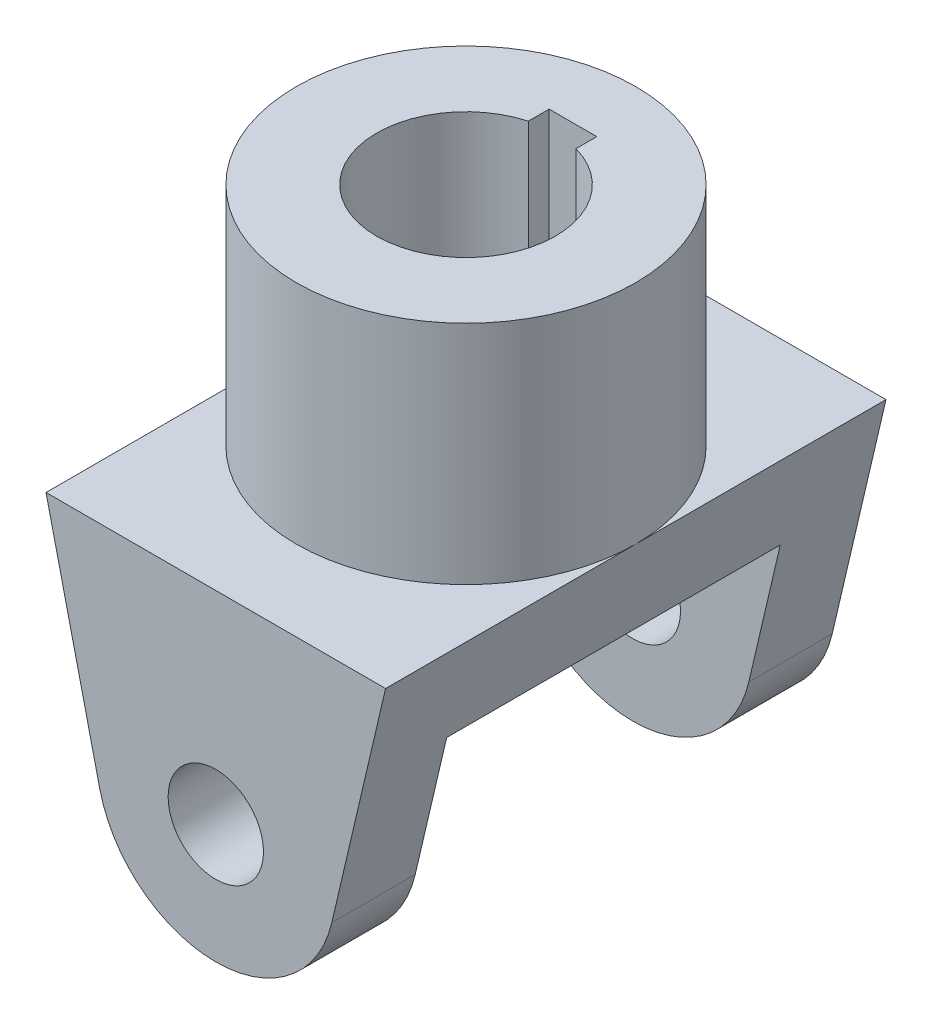
ISO-10303-21;
HEADER;
FILE_DESCRIPTION(('STEP AP214'),'2;1');
FILE_NAME('part.step','',(''),(''),'','','');
FILE_SCHEMA(('AUTOMOTIVE_DESIGN { 1 0 10303 214 1 1 1 1 }'));
ENDSEC;
DATA;
#1=APPLICATION_CONTEXT('core data for automotive mechanical design processes');
#2=APPLICATION_PROTOCOL_DEFINITION('international standard','automotive_design',2000,#1);
#3=PRODUCT_CONTEXT('',#1,'mechanical');
#4=PRODUCT('Part','Part','',(#3));
#5=PRODUCT_RELATED_PRODUCT_CATEGORY('part','',(#4));
#6=PRODUCT_DEFINITION_FORMATION('','',#4);
#7=PRODUCT_DEFINITION_CONTEXT('part definition',#1,'design');
#8=PRODUCT_DEFINITION('design','',#6,#7);
#9=PRODUCT_DEFINITION_SHAPE('','',#8);
#10=(LENGTH_UNIT() NAMED_UNIT(*) SI_UNIT(.MILLI.,.METRE.));
#11=(NAMED_UNIT(*) PLANE_ANGLE_UNIT() SI_UNIT($,.RADIAN.));
#12=(NAMED_UNIT(*) SI_UNIT($,.STERADIAN.) SOLID_ANGLE_UNIT());
#13=UNCERTAINTY_MEASURE_WITH_UNIT(LENGTH_MEASURE(1.E-05),#10,'distance_accuracy_value','');
#14=(GEOMETRIC_REPRESENTATION_CONTEXT(3) GLOBAL_UNCERTAINTY_ASSIGNED_CONTEXT((#13)) GLOBAL_UNIT_ASSIGNED_CONTEXT((#10,
#11,#12)) REPRESENTATION_CONTEXT('',''));
#15=CARTESIAN_POINT('',(0.,0.,0.));
#16=DIRECTION('',(0.,0.,1.));
#17=DIRECTION('',(1.,0.,0.));
#18=AXIS2_PLACEMENT_3D('',#15,#16,#17);
#19=CARTESIAN_POINT('',(28.5,-16.,-42.));
#20=DIRECTION('',(0.,0.,1.));
#21=DIRECTION('',(1.,0.,0.));
#22=AXIS2_PLACEMENT_3D('',#19,#20,#21);
#23=PLANE('',#22);
#24=CARTESIAN_POINT('',(0.,-34.,-42.));
#25=DIRECTION('',(0.,0.,-1.));
#26=DIRECTION('',(-1.,0.,0.));
#27=AXIS2_PLACEMENT_3D('',#24,#25,#26);
#28=CIRCLE('',#27,8.);
#29=CARTESIAN_POINT('',(-8.,-34.,-42.));
#30=VERTEX_POINT('',#29);
#31=EDGE_CURVE('E273',#30,#30,#28,.T.);
#32=ORIENTED_EDGE('',*,*,#31,.F.);
#33=EDGE_LOOP('',(#32));
#34=FACE_BOUND('',#33,.T.);
#35=DIRECTION('',(-0.227934655607735,-0.973676431250641,0.));
#36=VECTOR('',#35,1.);
#37=CARTESIAN_POINT('',(27.01930509403,-6.32513615786876,-42.));
#38=LINE('',#37,#36);
#39=CARTESIAN_POINT('',(28.5,0.,-42.));
#40=VERTEX_POINT('',#39);
#41=CARTESIAN_POINT('',(19.4735222245543,-38.5587204531304,-42.));
#42=VERTEX_POINT('',#41);
#43=EDGE_CURVE('E286',#40,#42,#38,.T.);
#44=ORIENTED_EDGE('',*,*,#43,.T.);
#45=CARTESIAN_POINT('',(0.,-34.,-42.));
#46=DIRECTION('',(0.,0.,1.));
#47=DIRECTION('',(1.,0.,0.));
#48=AXIS2_PLACEMENT_3D('',#45,#46,#47);
#49=CIRCLE('',#48,20.);
#50=CARTESIAN_POINT('',(-19.4735286250151,-38.558693112145,-42.));
#51=VERTEX_POINT('',#50);
#52=EDGE_CURVE('E261',#51,#42,#49,.T.);
#53=ORIENTED_EDGE('',*,*,#52,.F.);
#54=DIRECTION('',(0.22793465560725,-0.973676431250754,0.));
#55=VECTOR('',#54,1.);
#56=CARTESIAN_POINT('',(-27.0193050940363,-6.32513615785605,-42.));
#57=LINE('',#56,#55);
#58=CARTESIAN_POINT('',(-28.5,0.,-42.));
#59=VERTEX_POINT('',#58);
#60=EDGE_CURVE('E263',#59,#51,#57,.T.);
#61=ORIENTED_EDGE('',*,*,#60,.F.);
#62=DIRECTION('',(1.,0.,0.));
#63=VECTOR('',#62,1.);
#64=CARTESIAN_POINT('',(28.5,0.,-42.));
#65=LINE('',#64,#63);
#66=EDGE_CURVE('E229',#59,#40,#65,.T.);
#67=ORIENTED_EDGE('',*,*,#66,.T.);
#68=EDGE_LOOP('',(#44,#53,#61,#67));
#69=FACE_BOUND('',#68,.T.);
#70=ADVANCED_FACE('F63',(#34,#69),#23,.F.);
#71=CARTESIAN_POINT('',(28.5,-16.,42.));
#72=DIRECTION('',(0.,0.,-1.));
#73=DIRECTION('',(-1.,0.,0.));
#74=AXIS2_PLACEMENT_3D('',#71,#72,#73);
#75=PLANE('',#74);
#76=CARTESIAN_POINT('',(0.,-34.,42.));
#77=DIRECTION('',(0.,0.,-1.));
#78=DIRECTION('',(-1.,0.,0.));
#79=AXIS2_PLACEMENT_3D('',#76,#77,#78);
#80=CIRCLE('',#79,8.);
#81=CARTESIAN_POINT('',(-8.00000000000001,-34.,42.));
#82=VERTEX_POINT('',#81);
#83=EDGE_CURVE('E199',#82,#82,#80,.T.);
#84=ORIENTED_EDGE('',*,*,#83,.T.);
#85=EDGE_LOOP('',(#84));
#86=FACE_BOUND('',#85,.T.);
#87=CARTESIAN_POINT('',(0.,-34.,42.));
#88=DIRECTION('',(0.,0.,1.));
#89=DIRECTION('',(1.,0.,0.));
#90=AXIS2_PLACEMENT_3D('',#87,#88,#89);
#91=CIRCLE('',#90,20.);
#92=CARTESIAN_POINT('',(-19.4735286250151,-38.558693112145,42.));
#93=VERTEX_POINT('',#92);
#94=CARTESIAN_POINT('',(19.4735222245543,-38.5587204531304,42.));
#95=VERTEX_POINT('',#94);
#96=EDGE_CURVE('E250',#93,#95,#91,.T.);
#97=ORIENTED_EDGE('',*,*,#96,.T.);
#98=DIRECTION('',(-0.227934655607735,-0.973676431250641,0.));
#99=VECTOR('',#98,1.);
#100=CARTESIAN_POINT('',(27.01930509403,-6.32513615786876,42.));
#101=LINE('',#100,#99);
#102=CARTESIAN_POINT('',(28.5,0.,42.));
#103=VERTEX_POINT('',#102);
#104=EDGE_CURVE('E240',#103,#95,#101,.T.);
#105=ORIENTED_EDGE('',*,*,#104,.F.);
#106=DIRECTION('',(-1.,0.,0.));
#107=VECTOR('',#106,1.);
#108=CARTESIAN_POINT('',(28.5,0.,42.));
#109=LINE('',#108,#107);
#110=CARTESIAN_POINT('',(-28.5,0.,42.));
#111=VERTEX_POINT('',#110);
#112=EDGE_CURVE('E181',#103,#111,#109,.T.);
#113=ORIENTED_EDGE('',*,*,#112,.T.);
#114=DIRECTION('',(0.22793465560725,-0.973676431250754,0.));
#115=VECTOR('',#114,1.);
#116=CARTESIAN_POINT('',(-27.0193050940363,-6.32513615785605,42.));
#117=LINE('',#116,#115);
#118=EDGE_CURVE('E258',#111,#93,#117,.T.);
#119=ORIENTED_EDGE('',*,*,#118,.T.);
#120=EDGE_LOOP('',(#97,#105,#113,#119));
#121=FACE_BOUND('',#120,.T.);
#122=ADVANCED_FACE('F246',(#86,#121),#75,.F.);
#123=CARTESIAN_POINT('',(0.,0.,28.));
#124=DIRECTION('',(0.,0.,1.));
#125=DIRECTION('',(1.,0.,0.));
#126=AXIS2_PLACEMENT_3D('',#123,#124,#125);
#127=PLANE('',#126);
#128=CARTESIAN_POINT('',(0.,-34.,28.));
#129=DIRECTION('',(0.,0.,1.));
#130=DIRECTION('',(1.,0.,0.));
#131=AXIS2_PLACEMENT_3D('',#128,#129,#130);
#132=CIRCLE('',#131,8.);
#133=CARTESIAN_POINT('',(-8.00000000000001,-34.,28.));
#134=VERTEX_POINT('',#133);
#135=EDGE_CURVE('E198',#134,#134,#132,.T.);
#136=ORIENTED_EDGE('',*,*,#135,.T.);
#137=EDGE_LOOP('',(#136));
#138=FACE_BOUND('',#137,.T.);
#139=DIRECTION('',(-0.227934655607735,-0.973676431250641,0.));
#140=VECTOR('',#139,1.);
#141=CARTESIAN_POINT('',(27.01930509403,-6.32513615786876,28.));
#142=LINE('',#141,#140);
#143=CARTESIAN_POINT('',(24.7544492475396,-16.,28.));
#144=VERTEX_POINT('',#143);
#145=CARTESIAN_POINT('',(19.4735222245543,-38.5587204531304,28.));
#146=VERTEX_POINT('',#145);
#147=EDGE_CURVE('E265',#144,#146,#142,.T.);
#148=ORIENTED_EDGE('',*,*,#147,.T.);
#149=CARTESIAN_POINT('',(0.,-34.,28.));
#150=DIRECTION('',(0.,0.,1.));
#151=DIRECTION('',(1.,0.,0.));
#152=AXIS2_PLACEMENT_3D('',#149,#150,#151);
#153=CIRCLE('',#152,20.);
#154=CARTESIAN_POINT('',(-19.4735286250151,-38.558693112145,28.));
#155=VERTEX_POINT('',#154);
#156=EDGE_CURVE('E271',#155,#146,#153,.T.);
#157=ORIENTED_EDGE('',*,*,#156,.F.);
#158=DIRECTION('',(0.22793465560725,-0.973676431250754,0.));
#159=VECTOR('',#158,1.);
#160=CARTESIAN_POINT('',(-27.0193050940363,-6.32513615785605,28.));
#161=LINE('',#160,#159);
#162=CARTESIAN_POINT('',(-24.7544492475481,-16.,28.));
#163=VERTEX_POINT('',#162);
#164=EDGE_CURVE('E214',#163,#155,#161,.T.);
#165=ORIENTED_EDGE('',*,*,#164,.F.);
#166=DIRECTION('',(-1.,0.,0.));
#167=VECTOR('',#166,1.);
#168=CARTESIAN_POINT('',(-28.5,-16.,28.));
#169=LINE('',#168,#167);
#170=EDGE_CURVE('E67',#144,#163,#169,.T.);
#171=ORIENTED_EDGE('',*,*,#170,.F.);
#172=EDGE_LOOP('',(#148,#157,#165,#171));
#173=FACE_BOUND('',#172,.T.);
#174=ADVANCED_FACE('F303',(#138,#173),#127,.F.);
#175=CARTESIAN_POINT('',(0.,0.,-28.));
#176=DIRECTION('',(0.,0.,-1.));
#177=DIRECTION('',(-1.,0.,0.));
#178=AXIS2_PLACEMENT_3D('',#175,#176,#177);
#179=PLANE('',#178);
#180=CARTESIAN_POINT('',(0.,-34.,-28.));
#181=DIRECTION('',(0.,0.,-1.));
#182=DIRECTION('',(-1.,0.,0.));
#183=AXIS2_PLACEMENT_3D('',#180,#181,#182);
#184=CIRCLE('',#183,8.);
#185=CARTESIAN_POINT('',(-8.00000000000001,-34.,-28.));
#186=VERTEX_POINT('',#185);
#187=EDGE_CURVE('E195',#186,#186,#184,.T.);
#188=ORIENTED_EDGE('',*,*,#187,.T.);
#189=EDGE_LOOP('',(#188));
#190=FACE_BOUND('',#189,.T.);
#191=CARTESIAN_POINT('',(0.,-34.,-28.));
#192=DIRECTION('',(0.,0.,-1.));
#193=DIRECTION('',(-1.,0.,0.));
#194=AXIS2_PLACEMENT_3D('',#191,#192,#193);
#195=CIRCLE('',#194,20.);
#196=CARTESIAN_POINT('',(19.4735222245543,-38.5587204531304,-28.));
#197=VERTEX_POINT('',#196);
#198=CARTESIAN_POINT('',(-19.4735286250151,-38.558693112145,-28.));
#199=VERTEX_POINT('',#198);
#200=EDGE_CURVE('E12',#197,#199,#195,.T.);
#201=ORIENTED_EDGE('',*,*,#200,.F.);
#202=DIRECTION('',(0.227934655607735,0.973676431250641,0.));
#203=VECTOR('',#202,1.);
#204=CARTESIAN_POINT('',(27.01930509403,-6.32513615786876,-28.));
#205=LINE('',#204,#203);
#206=CARTESIAN_POINT('',(24.7544492475396,-16.,-28.));
#207=VERTEX_POINT('',#206);
#208=EDGE_CURVE('E219',#197,#207,#205,.T.);
#209=ORIENTED_EDGE('',*,*,#208,.T.);
#210=DIRECTION('',(1.,0.,0.));
#211=VECTOR('',#210,1.);
#212=CARTESIAN_POINT('',(28.5,-16.,-28.));
#213=LINE('',#212,#211);
#214=CARTESIAN_POINT('',(-24.7544492475481,-16.,-28.));
#215=VERTEX_POINT('',#214);
#216=EDGE_CURVE('E212',#215,#207,#213,.T.);
#217=ORIENTED_EDGE('',*,*,#216,.F.);
#218=DIRECTION('',(-0.22793465560725,0.973676431250754,0.));
#219=VECTOR('',#218,1.);
#220=CARTESIAN_POINT('',(-27.0193050940363,-6.32513615785605,-28.));
#221=LINE('',#220,#219);
#222=EDGE_CURVE('E73',#199,#215,#221,.T.);
#223=ORIENTED_EDGE('',*,*,#222,.F.);
#224=EDGE_LOOP('',(#201,#209,#217,#223));
#225=FACE_BOUND('',#224,.T.);
#226=ADVANCED_FACE('F217',(#190,#225),#179,.F.);
#227=CARTESIAN_POINT('',(0.,-16.,0.));
#228=DIRECTION('',(0.,1.,0.));
#229=DIRECTION('',(0.,0.,1.));
#230=AXIS2_PLACEMENT_3D('',#227,#228,#229);
#231=PLANE('',#230);
#232=ORIENTED_EDGE('',*,*,#216,.T.);
#233=DIRECTION('',(0.,0.,1.));
#234=VECTOR('',#233,1.);
#235=CARTESIAN_POINT('',(24.7544492475396,-16.,0.));
#236=LINE('',#235,#234);
#237=EDGE_CURVE('E296',#207,#144,#236,.T.);
#238=ORIENTED_EDGE('',*,*,#237,.T.);
#239=ORIENTED_EDGE('',*,*,#170,.T.);
#240=DIRECTION('',(0.,0.,1.));
#241=VECTOR('',#240,1.);
#242=CARTESIAN_POINT('',(-24.7544492475481,-16.,0.));
#243=LINE('',#242,#241);
#244=EDGE_CURVE('E204',#215,#163,#243,.T.);
#245=ORIENTED_EDGE('',*,*,#244,.F.);
#246=EDGE_LOOP('',(#232,#238,#239,#245));
#247=FACE_BOUND('',#246,.T.);
#248=ADVANCED_FACE('F210',(#247),#231,.F.);
#249=CARTESIAN_POINT('',(0.,38.,0.));
#250=DIRECTION('',(0.,1.,0.));
#251=DIRECTION('',(0.,0.,1.));
#252=AXIS2_PLACEMENT_3D('',#249,#250,#251);
#253=PLANE('',#252);
#254=DIRECTION('',(0.,0.,1.));
#255=VECTOR('',#254,1.);
#256=CARTESIAN_POINT('',(-4.,38.,-17.956832294801));
#257=LINE('',#256,#255);
#258=CARTESIAN_POINT('',(-4.,38.,-17.956832294801));
#259=VERTEX_POINT('',#258);
#260=CARTESIAN_POINT('',(-4.,38.,-14.456832294801));
#261=VERTEX_POINT('',#260);
#262=EDGE_CURVE('E344',#259,#261,#257,.T.);
#263=ORIENTED_EDGE('',*,*,#262,.F.);
#264=DIRECTION('',(-1.,0.,0.));
#265=VECTOR('',#264,1.);
#266=CARTESIAN_POINT('',(-4.,38.,-17.956832294801));
#267=LINE('',#266,#265);
#268=CARTESIAN_POINT('',(4.,38.,-17.956832294801));
#269=VERTEX_POINT('',#268);
#270=EDGE_CURVE('E483',#269,#259,#267,.T.);
#271=ORIENTED_EDGE('',*,*,#270,.F.);
#272=DIRECTION('',(0.,0.,-1.));
#273=VECTOR('',#272,1.);
#274=CARTESIAN_POINT('',(4.,38.,-17.956832294801));
#275=LINE('',#274,#273);
#276=CARTESIAN_POINT('',(4.,38.,-14.456832294801));
#277=VERTEX_POINT('',#276);
#278=EDGE_CURVE('E484',#277,#269,#275,.T.);
#279=ORIENTED_EDGE('',*,*,#278,.F.);
#280=CARTESIAN_POINT('',(0.,38.,0.));
#281=DIRECTION('',(0.,1.,0.));
#282=DIRECTION('',(0.,0.,1.));
#283=AXIS2_PLACEMENT_3D('',#280,#281,#282);
#284=CIRCLE('',#283,15.);
#285=EDGE_CURVE('E177',#261,#277,#284,.T.);
#286=ORIENTED_EDGE('',*,*,#285,.F.);
#287=EDGE_LOOP('',(#263,#271,#279,#286));
#288=FACE_BOUND('',#287,.T.);
#289=CARTESIAN_POINT('',(0.,38.,0.));
#290=DIRECTION('',(0.,1.,0.));
#291=DIRECTION('',(0.,0.,1.));
#292=AXIS2_PLACEMENT_3D('',#289,#290,#291);
#293=CIRCLE('',#292,28.5);
#294=CARTESIAN_POINT('',(0.,38.,28.5));
#295=VERTEX_POINT('',#294);
#296=EDGE_CURVE('E189',#295,#295,#293,.T.);
#297=ORIENTED_EDGE('',*,*,#296,.T.);
#298=EDGE_LOOP('',(#297));
#299=FACE_BOUND('',#298,.T.);
#300=ADVANCED_FACE('F327',(#288,#299),#253,.T.);
#301=CARTESIAN_POINT('',(0.,38.,0.));
#302=DIRECTION('',(0.,-1.,0.));
#303=DIRECTION('',(0.,0.,-1.));
#304=AXIS2_PLACEMENT_3D('',#301,#302,#303);
#305=CYLINDRICAL_SURFACE('',#304,28.5);
#306=ORIENTED_EDGE('',*,*,#296,.F.);
#307=EDGE_LOOP('',(#306));
#308=FACE_BOUND('',#307,.T.);
#309=CARTESIAN_POINT('',(0.,0.,0.));
#310=DIRECTION('',(0.,1.,0.));
#311=DIRECTION('',(0.,0.,1.));
#312=AXIS2_PLACEMENT_3D('',#309,#310,#311);
#313=CIRCLE('',#312,28.5);
#314=CARTESIAN_POINT('',(28.5,0.,0.));
#315=VERTEX_POINT('',#314);
#316=CARTESIAN_POINT('',(-28.5,0.,0.));
#317=VERTEX_POINT('',#316);
#318=EDGE_CURVE('E192',#315,#317,#313,.T.);
#319=ORIENTED_EDGE('',*,*,#318,.T.);
#320=EDGE_CURVE('E183',#317,#315,#313,.T.);
#321=ORIENTED_EDGE('',*,*,#320,.T.);
#322=EDGE_LOOP('',(#319,#321));
#323=FACE_BOUND('',#322,.T.);
#324=ADVANCED_FACE('F65',(#308,#323),#305,.T.);
#325=CARTESIAN_POINT('',(0.,38.,0.));
#326=DIRECTION('',(0.,-1.,0.));
#327=DIRECTION('',(0.,0.,-1.));
#328=AXIS2_PLACEMENT_3D('',#325,#326,#327);
#329=CYLINDRICAL_SURFACE('',#328,15.);
#330=DIRECTION('',(0.,1.,0.));
#331=VECTOR('',#330,1.);
#332=CARTESIAN_POINT('',(-4.,0.,-14.456832294801));
#333=LINE('',#332,#331);
#334=CARTESIAN_POINT('',(-4.,0.,-14.456832294801));
#335=VERTEX_POINT('',#334);
#336=EDGE_CURVE('E178',#335,#261,#333,.T.);
#337=ORIENTED_EDGE('',*,*,#336,.T.);
#338=ORIENTED_EDGE('',*,*,#285,.T.);
#339=DIRECTION('',(0.,1.,0.));
#340=VECTOR('',#339,1.);
#341=CARTESIAN_POINT('',(4.,0.,-14.456832294801));
#342=LINE('',#341,#340);
#343=CARTESIAN_POINT('',(4.,0.,-14.456832294801));
#344=VERTEX_POINT('',#343);
#345=EDGE_CURVE('E164',#344,#277,#342,.T.);
#346=ORIENTED_EDGE('',*,*,#345,.F.);
#347=CARTESIAN_POINT('',(0.,0.,0.));
#348=DIRECTION('',(0.,1.,0.));
#349=DIRECTION('',(0.,0.,1.));
#350=AXIS2_PLACEMENT_3D('',#347,#348,#349);
#351=CIRCLE('',#350,15.);
#352=EDGE_CURVE('E175',#335,#344,#351,.T.);
#353=ORIENTED_EDGE('',*,*,#352,.F.);
#354=EDGE_LOOP('',(#337,#338,#346,#353));
#355=FACE_BOUND('',#354,.T.);
#356=ADVANCED_FACE('F174',(#355),#329,.F.);
#357=CARTESIAN_POINT('',(0.,0.,0.));
#358=DIRECTION('',(0.,1.,0.));
#359=DIRECTION('',(0.,0.,1.));
#360=AXIS2_PLACEMENT_3D('',#357,#358,#359);
#361=PLANE('',#360);
#362=ORIENTED_EDGE('',*,*,#352,.T.);
#363=DIRECTION('',(0.,0.,-1.));
#364=VECTOR('',#363,1.);
#365=CARTESIAN_POINT('',(4.,0.,-17.956832294801));
#366=LINE('',#365,#364);
#367=CARTESIAN_POINT('',(4.,0.,-17.956832294801));
#368=VERTEX_POINT('',#367);
#369=EDGE_CURVE('E160',#344,#368,#366,.T.);
#370=ORIENTED_EDGE('',*,*,#369,.T.);
#371=DIRECTION('',(-1.,0.,0.));
#372=VECTOR('',#371,1.);
#373=CARTESIAN_POINT('',(-4.,0.,-17.956832294801));
#374=LINE('',#373,#372);
#375=CARTESIAN_POINT('',(-4.,0.,-17.956832294801));
#376=VERTEX_POINT('',#375);
#377=EDGE_CURVE('E168',#368,#376,#374,.T.);
#378=ORIENTED_EDGE('',*,*,#377,.T.);
#379=DIRECTION('',(0.,0.,1.));
#380=VECTOR('',#379,1.);
#381=CARTESIAN_POINT('',(-4.,0.,-17.956832294801));
#382=LINE('',#381,#380);
#383=EDGE_CURVE('E80',#376,#335,#382,.T.);
#384=ORIENTED_EDGE('',*,*,#383,.T.);
#385=EDGE_LOOP('',(#362,#370,#378,#384));
#386=FACE_BOUND('',#385,.T.);
#387=ADVANCED_FACE('F180',(#386),#361,.T.);
#388=ORIENTED_EDGE('',*,*,#318,.F.);
#389=DIRECTION('',(0.,0.,1.));
#390=VECTOR('',#389,1.);
#391=CARTESIAN_POINT('',(28.5,0.,42.));
#392=LINE('',#391,#390);
#393=EDGE_CURVE('E186',#40,#315,#392,.T.);
#394=ORIENTED_EDGE('',*,*,#393,.F.);
#395=ORIENTED_EDGE('',*,*,#66,.F.);
#396=DIRECTION('',(0.,0.,-1.));
#397=VECTOR('',#396,1.);
#398=CARTESIAN_POINT('',(-28.5,0.,42.));
#399=LINE('',#398,#397);
#400=EDGE_CURVE('E221',#317,#59,#399,.T.);
#401=ORIENTED_EDGE('',*,*,#400,.F.);
#402=EDGE_LOOP('',(#388,#394,#395,#401));
#403=FACE_BOUND('',#402,.T.);
#404=ADVANCED_FACE('F330',(#403),#361,.T.);
#405=ORIENTED_EDGE('',*,*,#320,.F.);
#406=EDGE_CURVE('E227',#111,#317,#399,.T.);
#407=ORIENTED_EDGE('',*,*,#406,.F.);
#408=ORIENTED_EDGE('',*,*,#112,.F.);
#409=EDGE_CURVE('E232',#315,#103,#392,.T.);
#410=ORIENTED_EDGE('',*,*,#409,.F.);
#411=EDGE_LOOP('',(#405,#407,#408,#410));
#412=FACE_BOUND('',#411,.T.);
#413=ADVANCED_FACE('F254',(#412),#361,.T.);
#414=CARTESIAN_POINT('',(0.,-34.,42.));
#415=DIRECTION('',(0.,0.,-1.));
#416=DIRECTION('',(-1.,0.,0.));
#417=AXIS2_PLACEMENT_3D('',#414,#415,#416);
#418=CYLINDRICAL_SURFACE('',#417,8.);
#419=CARTESIAN_POINT('',(-8.,-34.,-42.));
#420=CARTESIAN_POINT('',(-8.,-34.,-41.8541666666667));
#421=CARTESIAN_POINT('',(-8.,-34.,-41.7083333333333));
#422=CARTESIAN_POINT('',(-8.,-34.,-41.4166666666667));
#423=CARTESIAN_POINT('',(-8.,-34.,-41.2708333333333));
#424=CARTESIAN_POINT('',(-8.,-34.,-40.9791666666667));
#425=CARTESIAN_POINT('',(-8.,-34.,-40.8333333333333));
#426=CARTESIAN_POINT('',(-8.,-34.,-40.5416666666667));
#427=CARTESIAN_POINT('',(-8.,-34.,-40.3958333333333));
#428=CARTESIAN_POINT('',(-8.,-34.,-40.1041666666667));
#429=CARTESIAN_POINT('',(-8.,-34.,-39.9583333333333));
#430=CARTESIAN_POINT('',(-8.,-34.,-39.6666666666667));
#431=CARTESIAN_POINT('',(-8.,-34.,-39.5208333333333));
#432=CARTESIAN_POINT('',(-8.,-34.,-39.2291666666667));
#433=CARTESIAN_POINT('',(-8.,-34.,-39.0833333333333));
#434=CARTESIAN_POINT('',(-8.,-34.,-38.7916666666667));
#435=CARTESIAN_POINT('',(-8.,-34.,-38.6458333333333));
#436=CARTESIAN_POINT('',(-8.,-34.,-38.3541666666667));
#437=CARTESIAN_POINT('',(-8.,-34.,-38.2083333333333));
#438=CARTESIAN_POINT('',(-8.,-34.,-37.9166666666667));
#439=CARTESIAN_POINT('',(-8.,-34.,-37.7708333333333));
#440=CARTESIAN_POINT('',(-8.,-34.,-37.4791666666667));
#441=CARTESIAN_POINT('',(-8.,-34.,-37.3333333333333));
#442=CARTESIAN_POINT('',(-8.,-34.,-37.0416666666667));
#443=CARTESIAN_POINT('',(-8.,-34.,-36.8958333333333));
#444=CARTESIAN_POINT('',(-8.,-34.,-36.6041666666667));
#445=CARTESIAN_POINT('',(-8.00000000000001,-34.,-36.4583333333333));
#446=CARTESIAN_POINT('',(-8.00000000000001,-34.,-36.1666666666667));
#447=CARTESIAN_POINT('',(-8.00000000000001,-34.,-36.0208333333333));
#448=CARTESIAN_POINT('',(-8.00000000000001,-34.,-35.7291666666667));
#449=CARTESIAN_POINT('',(-8.00000000000001,-34.,-35.5833333333333));
#450=CARTESIAN_POINT('',(-8.00000000000001,-34.,-35.2916666666667));
#451=CARTESIAN_POINT('',(-8.00000000000001,-34.,-35.1458333333333));
#452=CARTESIAN_POINT('',(-8.00000000000001,-34.,-34.8541666666667));
#453=CARTESIAN_POINT('',(-8.00000000000001,-34.,-34.7083333333333));
#454=CARTESIAN_POINT('',(-8.00000000000001,-34.,-34.4166666666667));
#455=CARTESIAN_POINT('',(-8.00000000000001,-34.,-34.2708333333333));
#456=CARTESIAN_POINT('',(-8.00000000000001,-34.,-33.9791666666667));
#457=CARTESIAN_POINT('',(-8.00000000000001,-34.,-33.8333333333333));
#458=CARTESIAN_POINT('',(-8.00000000000001,-34.,-33.5416666666667));
#459=CARTESIAN_POINT('',(-8.00000000000001,-34.,-33.3958333333333));
#460=CARTESIAN_POINT('',(-8.00000000000001,-34.,-33.1041666666667));
#461=CARTESIAN_POINT('',(-8.00000000000001,-34.,-32.9583333333333));
#462=CARTESIAN_POINT('',(-8.00000000000001,-34.,-32.6666666666667));
#463=CARTESIAN_POINT('',(-8.00000000000001,-34.,-32.5208333333333));
#464=CARTESIAN_POINT('',(-8.00000000000001,-34.,-32.2291666666667));
#465=CARTESIAN_POINT('',(-8.00000000000001,-34.,-32.0833333333333));
#466=CARTESIAN_POINT('',(-8.00000000000001,-34.,-31.7916666666667));
#467=CARTESIAN_POINT('',(-8.00000000000001,-34.,-31.6458333333334));
#468=CARTESIAN_POINT('',(-8.00000000000001,-34.,-31.3541666666667));
#469=CARTESIAN_POINT('',(-8.00000000000001,-34.,-31.2083333333333));
#470=CARTESIAN_POINT('',(-8.00000000000001,-34.,-30.9166666666667));
#471=CARTESIAN_POINT('',(-8.00000000000001,-34.,-30.7708333333333));
#472=CARTESIAN_POINT('',(-8.00000000000001,-34.,-30.4791666666667));
#473=CARTESIAN_POINT('',(-8.00000000000001,-34.,-30.3333333333333));
#474=CARTESIAN_POINT('',(-8.00000000000001,-34.,-30.0416666666667));
#475=CARTESIAN_POINT('',(-8.00000000000001,-34.,-29.8958333333333));
#476=CARTESIAN_POINT('',(-8.00000000000001,-34.,-29.6041666666667));
#477=CARTESIAN_POINT('',(-8.00000000000001,-34.,-29.4583333333333));
#478=CARTESIAN_POINT('',(-8.00000000000001,-34.,-29.1666666666667));
#479=CARTESIAN_POINT('',(-8.00000000000001,-34.,-29.0208333333333));
#480=CARTESIAN_POINT('',(-8.00000000000001,-34.,-28.7291666666667));
#481=CARTESIAN_POINT('',(-8.00000000000001,-34.,-28.5833333333334));
#482=CARTESIAN_POINT('',(-8.00000000000001,-34.,-28.2916666666667));
#483=CARTESIAN_POINT('',(-8.00000000000001,-34.,-28.1458333333334));
#484=CARTESIAN_POINT('',(-8.00000000000001,-34.,-28.));
#485=B_SPLINE_CURVE_WITH_KNOTS('',3,(#419,#420,#421,#422,#423,#424,#425,#426,#427,#428,#429,
#430,#431,#432,#433,#434,#435,#436,#437,#438,#439,#440,#441,#442,#443,#444,#445,#446,#447,#448,
#449,#450,#451,#452,#453,#454,#455,#456,#457,#458,#459,#460,#461,#462,#463,#464,#465,#466,#467,
#468,#469,#470,#471,#472,#473,#474,#475,#476,#477,#478,#479,#480,#481,#482,#483,#484),
.UNSPECIFIED.,.F.,.F.,(4,2,2,2,2,2,2,2,2,2,2,2,2,2,2,2,2,2,2,2,2,2,2,2,2,2,2,2,2,2,2,2,4),(0.,
0.437499999999993,0.875000000000001,1.31249999999999,1.75,2.1875,2.625,3.0625,3.5,3.9375,
4.37499999999999,4.8125,5.24999999999999,5.6875,6.12499999999999,6.5625,6.99999999999999,
7.43749999999999,7.87499999999999,8.31249999999999,8.74999999999999,9.18749999999999,
9.62499999999999,10.0625,10.5,10.9375,11.375,11.8125,12.25,12.6875,13.125,13.5625,14.),.UNSPECIFIED.);
#486=EDGE_CURVE('BSEAM278',#30,#186,#485,.T.);
#487=ORIENTED_EDGE('',*,*,#31,.T.);
#488=ORIENTED_EDGE('',*,*,#187,.F.);
#489=ORIENTED_EDGE('',*,*,#486,.T.);
#490=ORIENTED_EDGE('',*,*,#486,.F.);
#491=EDGE_LOOP('',(#487,#489,#488,#490));
#492=FACE_BOUND('',#491,.T.);
#493=ADVANCED_FACE('F278',(#492),#418,.F.);
#494=CARTESIAN_POINT('',(-8.00000000000001,-34.,42.));
#495=CARTESIAN_POINT('',(-8.00000000000001,-34.,41.8541666666667));
#496=CARTESIAN_POINT('',(-8.00000000000001,-34.,41.7083333333333));
#497=CARTESIAN_POINT('',(-8.00000000000001,-34.,41.4166666666667));
#498=CARTESIAN_POINT('',(-8.00000000000001,-34.,41.2708333333333));
#499=CARTESIAN_POINT('',(-8.00000000000001,-34.,40.9791666666667));
#500=CARTESIAN_POINT('',(-8.00000000000001,-34.,40.8333333333333));
#501=CARTESIAN_POINT('',(-8.00000000000001,-34.,40.5416666666667));
#502=CARTESIAN_POINT('',(-8.00000000000001,-34.,40.3958333333333));
#503=CARTESIAN_POINT('',(-8.00000000000001,-34.,40.1041666666667));
#504=CARTESIAN_POINT('',(-8.00000000000001,-34.,39.9583333333333));
#505=CARTESIAN_POINT('',(-8.00000000000001,-34.,39.6666666666667));
#506=CARTESIAN_POINT('',(-8.00000000000001,-34.,39.5208333333333));
#507=CARTESIAN_POINT('',(-8.00000000000001,-34.,39.2291666666667));
#508=CARTESIAN_POINT('',(-8.00000000000001,-34.,39.0833333333333));
#509=CARTESIAN_POINT('',(-8.00000000000001,-34.,38.7916666666667));
#510=CARTESIAN_POINT('',(-8.00000000000001,-34.,38.6458333333333));
#511=CARTESIAN_POINT('',(-8.00000000000001,-34.,38.3541666666667));
#512=CARTESIAN_POINT('',(-8.00000000000001,-34.,38.2083333333333));
#513=CARTESIAN_POINT('',(-8.00000000000001,-34.,37.9166666666667));
#514=CARTESIAN_POINT('',(-8.00000000000001,-34.,37.7708333333333));
#515=CARTESIAN_POINT('',(-8.00000000000001,-34.,37.4791666666667));
#516=CARTESIAN_POINT('',(-8.00000000000001,-34.,37.3333333333333));
#517=CARTESIAN_POINT('',(-8.00000000000001,-34.,37.0416666666667));
#518=CARTESIAN_POINT('',(-8.00000000000001,-34.,36.8958333333333));
#519=CARTESIAN_POINT('',(-8.00000000000001,-34.,36.6041666666667));
#520=CARTESIAN_POINT('',(-8.00000000000001,-34.,36.4583333333333));
#521=CARTESIAN_POINT('',(-8.00000000000001,-34.,36.1666666666667));
#522=CARTESIAN_POINT('',(-8.00000000000001,-34.,36.0208333333333));
#523=CARTESIAN_POINT('',(-8.00000000000001,-34.,35.7291666666667));
#524=CARTESIAN_POINT('',(-8.00000000000001,-34.,35.5833333333333));
#525=CARTESIAN_POINT('',(-8.00000000000001,-34.,35.2916666666667));
#526=CARTESIAN_POINT('',(-8.00000000000001,-34.,35.1458333333333));
#527=CARTESIAN_POINT('',(-8.00000000000001,-34.,34.8541666666667));
#528=CARTESIAN_POINT('',(-8.00000000000001,-34.,34.7083333333333));
#529=CARTESIAN_POINT('',(-8.00000000000001,-34.,34.4166666666667));
#530=CARTESIAN_POINT('',(-8.00000000000001,-34.,34.2708333333333));
#531=CARTESIAN_POINT('',(-8.00000000000001,-34.,33.9791666666667));
#532=CARTESIAN_POINT('',(-8.00000000000001,-34.,33.8333333333333));
#533=CARTESIAN_POINT('',(-8.00000000000001,-34.,33.5416666666667));
#534=CARTESIAN_POINT('',(-8.00000000000001,-34.,33.3958333333333));
#535=CARTESIAN_POINT('',(-8.00000000000001,-34.,33.1041666666667));
#536=CARTESIAN_POINT('',(-8.00000000000001,-34.,32.9583333333333));
#537=CARTESIAN_POINT('',(-8.00000000000001,-34.,32.6666666666667));
#538=CARTESIAN_POINT('',(-8.00000000000001,-34.,32.5208333333333));
#539=CARTESIAN_POINT('',(-8.00000000000001,-34.,32.2291666666667));
#540=CARTESIAN_POINT('',(-8.00000000000001,-34.,32.0833333333333));
#541=CARTESIAN_POINT('',(-8.00000000000001,-34.,31.7916666666667));
#542=CARTESIAN_POINT('',(-8.00000000000001,-34.,31.6458333333333));
#543=CARTESIAN_POINT('',(-8.00000000000001,-34.,31.3541666666667));
#544=CARTESIAN_POINT('',(-8.00000000000001,-34.,31.2083333333333));
#545=CARTESIAN_POINT('',(-8.00000000000001,-34.,30.9166666666667));
#546=CARTESIAN_POINT('',(-8.00000000000001,-34.,30.7708333333333));
#547=CARTESIAN_POINT('',(-8.00000000000001,-34.,30.4791666666667));
#548=CARTESIAN_POINT('',(-8.00000000000001,-34.,30.3333333333333));
#549=CARTESIAN_POINT('',(-8.00000000000001,-34.,30.0416666666667));
#550=CARTESIAN_POINT('',(-8.00000000000001,-34.,29.8958333333333));
#551=CARTESIAN_POINT('',(-8.00000000000001,-34.,29.6041666666667));
#552=CARTESIAN_POINT('',(-8.00000000000001,-34.,29.4583333333333));
#553=CARTESIAN_POINT('',(-8.00000000000001,-34.,29.1666666666667));
#554=CARTESIAN_POINT('',(-8.00000000000001,-34.,29.0208333333333));
#555=CARTESIAN_POINT('',(-8.00000000000001,-34.,28.7291666666667));
#556=CARTESIAN_POINT('',(-8.00000000000001,-34.,28.5833333333333));
#557=CARTESIAN_POINT('',(-8.00000000000001,-34.,28.2916666666667));
#558=CARTESIAN_POINT('',(-8.00000000000001,-34.,28.1458333333333));
#559=CARTESIAN_POINT('',(-8.00000000000001,-34.,28.));
#560=B_SPLINE_CURVE_WITH_KNOTS('',3,(#494,#495,#496,#497,#498,#499,#500,#501,#502,#503,#504,
#505,#506,#507,#508,#509,#510,#511,#512,#513,#514,#515,#516,#517,#518,#519,#520,#521,#522,#523,
#524,#525,#526,#527,#528,#529,#530,#531,#532,#533,#534,#535,#536,#537,#538,#539,#540,#541,#542,
#543,#544,#545,#546,#547,#548,#549,#550,#551,#552,#553,#554,#555,#556,#557,#558,#559),
.UNSPECIFIED.,.F.,.F.,(4,2,2,2,2,2,2,2,2,2,2,2,2,2,2,2,2,2,2,2,2,2,2,2,2,2,2,2,2,2,2,2,4),(0.,
0.4375,0.875000000000001,1.3125,1.75,2.1875,2.625,3.0625,3.5,3.9375,4.375,4.8125,5.25,
5.68750000000001,6.125,6.5625,7.,7.4375,7.875,8.3125,8.75,9.1875,9.625,10.0625,10.5,10.9375,
11.375,11.8125,12.25,12.6875,13.125,13.5625,14.),.UNSPECIFIED.);
#561=EDGE_CURVE('BSEAM308',#82,#134,#560,.T.);
#562=ORIENTED_EDGE('',*,*,#83,.F.);
#563=ORIENTED_EDGE('',*,*,#135,.F.);
#564=ORIENTED_EDGE('',*,*,#561,.T.);
#565=ORIENTED_EDGE('',*,*,#561,.F.);
#566=EDGE_LOOP('',(#562,#564,#563,#565));
#567=FACE_BOUND('',#566,.T.);
#568=ADVANCED_FACE('F308',(#567),#418,.F.);
#569=CARTESIAN_POINT('',(0.,-34.,-42.));
#570=DIRECTION('',(0.,0.,1.));
#571=DIRECTION('',(1.,0.,0.));
#572=AXIS2_PLACEMENT_3D('',#569,#570,#571);
#573=CYLINDRICAL_SURFACE('',#572,20.);
#574=ORIENTED_EDGE('',*,*,#156,.T.);
#575=DIRECTION('',(0.,0.,1.));
#576=VECTOR('',#575,1.);
#577=CARTESIAN_POINT('',(19.4735222245543,-38.5587204531304,-42.));
#578=LINE('',#577,#576);
#579=EDGE_CURVE('E289',#146,#95,#578,.T.);
#580=ORIENTED_EDGE('',*,*,#579,.T.);
#581=ORIENTED_EDGE('',*,*,#96,.F.);
#582=DIRECTION('',(0.,0.,1.));
#583=VECTOR('',#582,1.);
#584=CARTESIAN_POINT('',(-19.4735286250151,-38.558693112145,-42.));
#585=LINE('',#584,#583);
#586=EDGE_CURVE('E260',#155,#93,#585,.T.);
#587=ORIENTED_EDGE('',*,*,#586,.F.);
#588=EDGE_LOOP('',(#574,#580,#581,#587));
#589=FACE_BOUND('',#588,.T.);
#590=ADVANCED_FACE('F306',(#589),#573,.T.);
#591=ORIENTED_EDGE('',*,*,#200,.T.);
#592=EDGE_CURVE('E88',#51,#199,#585,.T.);
#593=ORIENTED_EDGE('',*,*,#592,.F.);
#594=ORIENTED_EDGE('',*,*,#52,.T.);
#595=EDGE_CURVE('E252',#42,#197,#578,.T.);
#596=ORIENTED_EDGE('',*,*,#595,.T.);
#597=EDGE_LOOP('',(#591,#593,#594,#596));
#598=FACE_BOUND('',#597,.T.);
#599=ADVANCED_FACE('F300',(#598),#573,.T.);
#600=CARTESIAN_POINT('',(-27.0193050940363,-6.32513615785605,-42.));
#601=DIRECTION('',(-0.973676431250754,-0.22793465560725,0.));
#602=DIRECTION('',(0.22793465560725,-0.973676431250754,0.));
#603=AXIS2_PLACEMENT_3D('',#600,#601,#602);
#604=PLANE('',#603);
#605=ORIENTED_EDGE('',*,*,#164,.T.);
#606=ORIENTED_EDGE('',*,*,#586,.T.);
#607=ORIENTED_EDGE('',*,*,#118,.F.);
#608=ORIENTED_EDGE('',*,*,#406,.T.);
#609=ORIENTED_EDGE('',*,*,#400,.T.);
#610=ORIENTED_EDGE('',*,*,#60,.T.);
#611=ORIENTED_EDGE('',*,*,#592,.T.);
#612=ORIENTED_EDGE('',*,*,#222,.T.);
#613=ORIENTED_EDGE('',*,*,#244,.T.);
#614=EDGE_LOOP('',(#605,#606,#607,#608,#609,#610,#611,#612,#613));
#615=FACE_BOUND('',#614,.T.);
#616=ADVANCED_FACE('F203',(#615),#604,.T.);
#617=CARTESIAN_POINT('',(27.01930509403,-6.32513615786876,-42.));
#618=DIRECTION('',(-0.973676431250641,0.227934655607735,0.));
#619=DIRECTION('',(-0.227934655607735,-0.973676431250641,0.));
#620=AXIS2_PLACEMENT_3D('',#617,#618,#619);
#621=PLANE('',#620);
#622=ORIENTED_EDGE('',*,*,#237,.F.);
#623=ORIENTED_EDGE('',*,*,#208,.F.);
#624=ORIENTED_EDGE('',*,*,#595,.F.);
#625=ORIENTED_EDGE('',*,*,#43,.F.);
#626=ORIENTED_EDGE('',*,*,#393,.T.);
#627=ORIENTED_EDGE('',*,*,#409,.T.);
#628=ORIENTED_EDGE('',*,*,#104,.T.);
#629=ORIENTED_EDGE('',*,*,#579,.F.);
#630=ORIENTED_EDGE('',*,*,#147,.F.);
#631=EDGE_LOOP('',(#622,#623,#624,#625,#626,#627,#628,#629,#630));
#632=FACE_BOUND('',#631,.T.);
#633=ADVANCED_FACE('F238',(#632),#621,.F.);
#634=CARTESIAN_POINT('',(-4.,0.,-17.956832294801));
#635=DIRECTION('',(-1.,0.,0.));
#636=DIRECTION('',(0.,0.,1.));
#637=AXIS2_PLACEMENT_3D('',#634,#635,#636);
#638=PLANE('',#637);
#639=ORIENTED_EDGE('',*,*,#262,.T.);
#640=ORIENTED_EDGE('',*,*,#336,.F.);
#641=ORIENTED_EDGE('',*,*,#383,.F.);
#642=DIRECTION('',(0.,1.,0.));
#643=VECTOR('',#642,1.);
#644=CARTESIAN_POINT('',(-4.,0.,-17.956832294801));
#645=LINE('',#644,#643);
#646=EDGE_CURVE('E290',#376,#259,#645,.T.);
#647=ORIENTED_EDGE('',*,*,#646,.T.);
#648=EDGE_LOOP('',(#639,#640,#641,#647));
#649=FACE_BOUND('',#648,.T.);
#650=ADVANCED_FACE('F437',(#649),#638,.F.);
#651=CARTESIAN_POINT('',(-4.,0.,-17.956832294801));
#652=DIRECTION('',(0.,0.,-1.));
#653=DIRECTION('',(-1.,0.,0.));
#654=AXIS2_PLACEMENT_3D('',#651,#652,#653);
#655=PLANE('',#654);
#656=ORIENTED_EDGE('',*,*,#270,.T.);
#657=ORIENTED_EDGE('',*,*,#646,.F.);
#658=ORIENTED_EDGE('',*,*,#377,.F.);
#659=DIRECTION('',(0.,1.,0.));
#660=VECTOR('',#659,1.);
#661=CARTESIAN_POINT('',(4.,0.,-17.956832294801));
#662=LINE('',#661,#660);
#663=EDGE_CURVE('E166',#368,#269,#662,.T.);
#664=ORIENTED_EDGE('',*,*,#663,.T.);
#665=EDGE_LOOP('',(#656,#657,#658,#664));
#666=FACE_BOUND('',#665,.T.);
#667=ADVANCED_FACE('F460',(#666),#655,.F.);
#668=CARTESIAN_POINT('',(4.,0.,-17.956832294801));
#669=DIRECTION('',(1.,0.,0.));
#670=DIRECTION('',(0.,0.,-1.));
#671=AXIS2_PLACEMENT_3D('',#668,#669,#670);
#672=PLANE('',#671);
#673=ORIENTED_EDGE('',*,*,#278,.T.);
#674=ORIENTED_EDGE('',*,*,#663,.F.);
#675=ORIENTED_EDGE('',*,*,#369,.F.);
#676=ORIENTED_EDGE('',*,*,#345,.T.);
#677=EDGE_LOOP('',(#673,#674,#675,#676));
#678=FACE_BOUND('',#677,.T.);
#679=ADVANCED_FACE('F163',(#678),#672,.F.);
#680=CLOSED_SHELL('',(#70,#122,#174,#226,#248,#300,#324,#356,#387,#404,#413,#493,#568,#590,#599,
#616,#633,#650,#667,#679));
#681=MANIFOLD_SOLID_BREP('B2',#680);
#682=ADVANCED_BREP_SHAPE_REPRESENTATION('',(#18,#681),#14);
#683=SHAPE_DEFINITION_REPRESENTATION(#9,#682);
ENDSEC;
END-ISO-10303-21;
